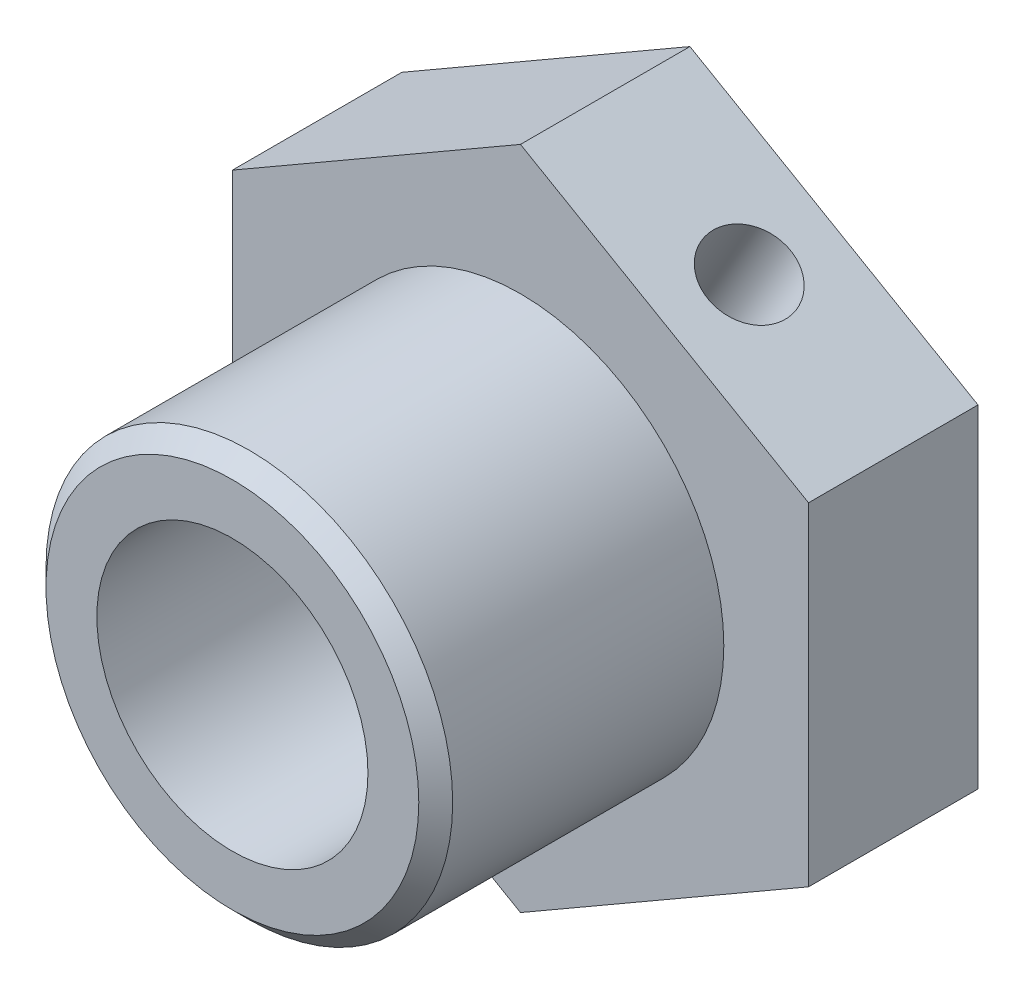
ISO-10303-21;
HEADER;
FILE_DESCRIPTION(('STEP AP214'),'2;1');
FILE_NAME('part.step','',(''),(''),'','','');
FILE_SCHEMA(('AUTOMOTIVE_DESIGN { 1 0 10303 214 1 1 1 1 }'));
ENDSEC;
DATA;
#1=APPLICATION_CONTEXT('core data for automotive mechanical design processes');
#2=APPLICATION_PROTOCOL_DEFINITION('international standard','automotive_design',2000,#1);
#3=PRODUCT_CONTEXT('',#1,'mechanical');
#4=PRODUCT('Part','Part','',(#3));
#5=PRODUCT_RELATED_PRODUCT_CATEGORY('part','',(#4));
#6=PRODUCT_DEFINITION_FORMATION('','',#4);
#7=PRODUCT_DEFINITION_CONTEXT('part definition',#1,'design');
#8=PRODUCT_DEFINITION('design','',#6,#7);
#9=PRODUCT_DEFINITION_SHAPE('','',#8);
#10=(LENGTH_UNIT() NAMED_UNIT(*) SI_UNIT(.MILLI.,.METRE.));
#11=(NAMED_UNIT(*) PLANE_ANGLE_UNIT() SI_UNIT($,.RADIAN.));
#12=(NAMED_UNIT(*) SI_UNIT($,.STERADIAN.) SOLID_ANGLE_UNIT());
#13=UNCERTAINTY_MEASURE_WITH_UNIT(LENGTH_MEASURE(1.E-05),#10,'distance_accuracy_value','');
#14=(GEOMETRIC_REPRESENTATION_CONTEXT(3) GLOBAL_UNCERTAINTY_ASSIGNED_CONTEXT((#13)) GLOBAL_UNIT_ASSIGNED_CONTEXT((#10,
#11,#12)) REPRESENTATION_CONTEXT('',''));
#15=CARTESIAN_POINT('',(0.,0.,0.));
#16=DIRECTION('',(0.,0.,1.));
#17=DIRECTION('',(1.,0.,0.));
#18=AXIS2_PLACEMENT_3D('',#15,#16,#17);
#19=CARTESIAN_POINT('',(8.49999999999993,4.90747728811191,5.));
#20=DIRECTION('',(-0.499999999999995,-0.866025403784441,0.));
#21=DIRECTION('',(0.866025403784441,-0.499999999999995,0.));
#22=AXIS2_PLACEMENT_3D('',#19,#20,#21);
#23=PLANE('',#22);
#24=CARTESIAN_POINT('',(4.24999999999997,7.36121593216777,2.5));
#25=DIRECTION('',(0.499999999999995,0.866025403784442,0.));
#26=DIRECTION('',(-0.866025403784442,0.499999999999995,0.));
#27=AXIS2_PLACEMENT_3D('',#24,#25,#26);
#28=CIRCLE('',#27,1.225);
#29=CARTESIAN_POINT('',(3.18911888036403,7.97371593216776,2.5));
#30=VERTEX_POINT('',#29);
#31=EDGE_CURVE('E187',#30,#30,#28,.T.);
#32=ORIENTED_EDGE('',*,*,#31,.F.);
#33=EDGE_LOOP('',(#32));
#34=FACE_BOUND('',#33,.T.);
#35=DIRECTION('',(-0.866025403784441,0.499999999999995,0.));
#36=VECTOR('',#35,1.);
#37=CARTESIAN_POINT('',(8.49999999999993,4.90747728811191,0.));
#38=LINE('',#37,#36);
#39=CARTESIAN_POINT('',(8.49999999999993,4.90747728811191,0.));
#40=VERTEX_POINT('',#39);
#41=CARTESIAN_POINT('',(0.,9.81495457622363,0.));
#42=VERTEX_POINT('',#41);
#43=EDGE_CURVE('E148',#40,#42,#38,.T.);
#44=ORIENTED_EDGE('',*,*,#43,.T.);
#45=DIRECTION('',(0.,0.,-1.));
#46=VECTOR('',#45,1.);
#47=CARTESIAN_POINT('',(0.,9.81495457622363,5.));
#48=LINE('',#47,#46);
#49=CARTESIAN_POINT('',(0.,9.81495457622363,5.));
#50=VERTEX_POINT('',#49);
#51=EDGE_CURVE('E174',#50,#42,#48,.T.);
#52=ORIENTED_EDGE('',*,*,#51,.F.);
#53=DIRECTION('',(-0.866025403784441,0.499999999999995,0.));
#54=VECTOR('',#53,1.);
#55=CARTESIAN_POINT('',(8.49999999999993,4.90747728811191,5.));
#56=LINE('',#55,#54);
#57=CARTESIAN_POINT('',(8.49999999999993,4.90747728811191,5.));
#58=VERTEX_POINT('',#57);
#59=EDGE_CURVE('E162',#58,#50,#56,.T.);
#60=ORIENTED_EDGE('',*,*,#59,.F.);
#61=DIRECTION('',(0.,0.,-1.));
#62=VECTOR('',#61,1.);
#63=CARTESIAN_POINT('',(8.49999999999993,4.90747728811191,5.));
#64=LINE('',#63,#62);
#65=EDGE_CURVE('E142',#58,#40,#64,.T.);
#66=ORIENTED_EDGE('',*,*,#65,.T.);
#67=EDGE_LOOP('',(#44,#52,#60,#66));
#68=FACE_BOUND('',#67,.T.);
#69=ADVANCED_FACE('F50',(#34,#68),#23,.F.);
#70=CARTESIAN_POINT('',(0.,9.81495457622363,5.));
#71=DIRECTION('',(0.500000000000001,-0.866025403784438,0.));
#72=DIRECTION('',(0.866025403784438,0.500000000000001,0.));
#73=AXIS2_PLACEMENT_3D('',#70,#71,#72);
#74=PLANE('',#73);
#75=DIRECTION('',(-0.866025403784438,-0.500000000000001,0.));
#76=VECTOR('',#75,1.);
#77=CARTESIAN_POINT('',(0.,9.81495457622363,0.));
#78=LINE('',#77,#76);
#79=CARTESIAN_POINT('',(-8.5,4.90747728811179,0.));
#80=VERTEX_POINT('',#79);
#81=EDGE_CURVE('E147',#42,#80,#78,.T.);
#82=ORIENTED_EDGE('',*,*,#81,.T.);
#83=DIRECTION('',(0.,0.,-1.));
#84=VECTOR('',#83,1.);
#85=CARTESIAN_POINT('',(-8.5,4.90747728811179,5.));
#86=LINE('',#85,#84);
#87=CARTESIAN_POINT('',(-8.5,4.90747728811179,5.));
#88=VERTEX_POINT('',#87);
#89=EDGE_CURVE('E168',#88,#80,#86,.T.);
#90=ORIENTED_EDGE('',*,*,#89,.F.);
#91=DIRECTION('',(-0.866025403784438,-0.500000000000001,0.));
#92=VECTOR('',#91,1.);
#93=CARTESIAN_POINT('',(0.,9.81495457622363,5.));
#94=LINE('',#93,#92);
#95=EDGE_CURVE('E112',#50,#88,#94,.T.);
#96=ORIENTED_EDGE('',*,*,#95,.F.);
#97=ORIENTED_EDGE('',*,*,#51,.T.);
#98=EDGE_LOOP('',(#82,#90,#96,#97));
#99=FACE_BOUND('',#98,.T.);
#100=ADVANCED_FACE('F201',(#99),#74,.F.);
#101=CARTESIAN_POINT('',(-8.5,4.90747728811179,5.));
#102=DIRECTION('',(1.,0.,0.));
#103=DIRECTION('',(0.,1.,0.));
#104=AXIS2_PLACEMENT_3D('',#101,#102,#103);
#105=PLANE('',#104);
#106=DIRECTION('',(0.,-1.,0.));
#107=VECTOR('',#106,1.);
#108=CARTESIAN_POINT('',(-8.5,4.90747728811179,0.));
#109=LINE('',#108,#107);
#110=CARTESIAN_POINT('',(-8.49999999999997,-4.90747728811185,0.));
#111=VERTEX_POINT('',#110);
#112=EDGE_CURVE('E152',#80,#111,#109,.T.);
#113=ORIENTED_EDGE('',*,*,#112,.T.);
#114=DIRECTION('',(0.,0.,-1.));
#115=VECTOR('',#114,1.);
#116=CARTESIAN_POINT('',(-8.49999999999997,-4.90747728811185,5.));
#117=LINE('',#116,#115);
#118=CARTESIAN_POINT('',(-8.49999999999997,-4.90747728811185,5.));
#119=VERTEX_POINT('',#118);
#120=EDGE_CURVE('E131',#119,#111,#117,.T.);
#121=ORIENTED_EDGE('',*,*,#120,.F.);
#122=DIRECTION('',(0.,-1.,0.));
#123=VECTOR('',#122,1.);
#124=CARTESIAN_POINT('',(-8.5,4.90747728811179,5.));
#125=LINE('',#124,#123);
#126=EDGE_CURVE('E122',#88,#119,#125,.T.);
#127=ORIENTED_EDGE('',*,*,#126,.F.);
#128=ORIENTED_EDGE('',*,*,#89,.T.);
#129=EDGE_LOOP('',(#113,#121,#127,#128));
#130=FACE_BOUND('',#129,.T.);
#131=ADVANCED_FACE('F209',(#130),#105,.F.);
#132=CARTESIAN_POINT('',(-8.49999999999997,-4.90747728811185,5.));
#133=DIRECTION('',(0.499999999999995,0.866025403784442,0.));
#134=DIRECTION('',(-0.866025403784442,0.499999999999995,0.));
#135=AXIS2_PLACEMENT_3D('',#132,#133,#134);
#136=PLANE('',#135);
#137=CARTESIAN_POINT('',(-4.24999999999995,-7.36121593216774,2.5));
#138=DIRECTION('',(0.499999999999995,0.866025403784442,0.));
#139=DIRECTION('',(-0.866025403784442,0.499999999999995,0.));
#140=AXIS2_PLACEMENT_3D('',#137,#138,#139);
#141=CIRCLE('',#140,1.225);
#142=CARTESIAN_POINT('',(-5.31088111963589,-6.74871593216774,2.5));
#143=VERTEX_POINT('',#142);
#144=EDGE_CURVE('E247',#143,#143,#141,.T.);
#145=ORIENTED_EDGE('',*,*,#144,.T.);
#146=EDGE_LOOP('',(#145));
#147=FACE_BOUND('',#146,.T.);
#148=DIRECTION('',(0.866025403784441,-0.499999999999995,0.));
#149=VECTOR('',#148,1.);
#150=CARTESIAN_POINT('',(-8.49999999999997,-4.90747728811185,0.));
#151=LINE('',#150,#149);
#152=CARTESIAN_POINT('',(0.,-9.81495457622363,0.));
#153=VERTEX_POINT('',#152);
#154=EDGE_CURVE('E133',#111,#153,#151,.T.);
#155=ORIENTED_EDGE('',*,*,#154,.T.);
#156=DIRECTION('',(0.,0.,-1.));
#157=VECTOR('',#156,1.);
#158=CARTESIAN_POINT('',(0.,-9.81495457622363,5.));
#159=LINE('',#158,#157);
#160=CARTESIAN_POINT('',(0.,-9.81495457622363,5.));
#161=VERTEX_POINT('',#160);
#162=EDGE_CURVE('E128',#161,#153,#159,.T.);
#163=ORIENTED_EDGE('',*,*,#162,.F.);
#164=DIRECTION('',(0.866025403784441,-0.499999999999995,0.));
#165=VECTOR('',#164,1.);
#166=CARTESIAN_POINT('',(-8.49999999999997,-4.90747728811185,5.));
#167=LINE('',#166,#165);
#168=EDGE_CURVE('E118',#119,#161,#167,.T.);
#169=ORIENTED_EDGE('',*,*,#168,.F.);
#170=ORIENTED_EDGE('',*,*,#120,.T.);
#171=EDGE_LOOP('',(#155,#163,#169,#170));
#172=FACE_BOUND('',#171,.T.);
#173=ADVANCED_FACE('F132',(#147,#172),#136,.F.);
#174=CARTESIAN_POINT('',(0.,-9.81495457622363,5.));
#175=DIRECTION('',(-0.500000000000007,0.866025403784434,0.));
#176=DIRECTION('',(-0.866025403784435,-0.500000000000007,0.));
#177=AXIS2_PLACEMENT_3D('',#174,#175,#176);
#178=PLANE('',#177);
#179=DIRECTION('',(0.866025403784435,0.500000000000007,0.));
#180=VECTOR('',#179,1.);
#181=CARTESIAN_POINT('',(0.,-9.81495457622363,0.));
#182=LINE('',#181,#180);
#183=CARTESIAN_POINT('',(8.50000000000003,-4.90747728811173,0.));
#184=VERTEX_POINT('',#183);
#185=EDGE_CURVE('E96',#153,#184,#182,.T.);
#186=ORIENTED_EDGE('',*,*,#185,.T.);
#187=DIRECTION('',(0.,0.,-1.));
#188=VECTOR('',#187,1.);
#189=CARTESIAN_POINT('',(8.50000000000003,-4.90747728811173,5.));
#190=LINE('',#189,#188);
#191=CARTESIAN_POINT('',(8.50000000000003,-4.90747728811173,5.));
#192=VERTEX_POINT('',#191);
#193=EDGE_CURVE('E138',#192,#184,#190,.T.);
#194=ORIENTED_EDGE('',*,*,#193,.F.);
#195=DIRECTION('',(0.866025403784435,0.500000000000007,0.));
#196=VECTOR('',#195,1.);
#197=CARTESIAN_POINT('',(0.,-9.81495457622363,5.));
#198=LINE('',#197,#196);
#199=EDGE_CURVE('E125',#161,#192,#198,.T.);
#200=ORIENTED_EDGE('',*,*,#199,.F.);
#201=ORIENTED_EDGE('',*,*,#162,.T.);
#202=EDGE_LOOP('',(#186,#194,#200,#201));
#203=FACE_BOUND('',#202,.T.);
#204=ADVANCED_FACE('F136',(#203),#178,.F.);
#205=CARTESIAN_POINT('',(8.50000000000003,-4.90747728811173,5.));
#206=DIRECTION('',(-1.,0.,0.));
#207=DIRECTION('',(0.,-1.,0.));
#208=AXIS2_PLACEMENT_3D('',#205,#206,#207);
#209=PLANE('',#208);
#210=DIRECTION('',(0.,1.,0.));
#211=VECTOR('',#210,1.);
#212=CARTESIAN_POINT('',(8.50000000000003,-4.90747728811173,0.));
#213=LINE('',#212,#211);
#214=EDGE_CURVE('E105',#184,#40,#213,.T.);
#215=ORIENTED_EDGE('',*,*,#214,.T.);
#216=ORIENTED_EDGE('',*,*,#65,.F.);
#217=DIRECTION('',(0.,1.,0.));
#218=VECTOR('',#217,1.);
#219=CARTESIAN_POINT('',(8.50000000000003,-4.90747728811173,5.));
#220=LINE('',#219,#218);
#221=EDGE_CURVE('E71',#192,#58,#220,.T.);
#222=ORIENTED_EDGE('',*,*,#221,.F.);
#223=ORIENTED_EDGE('',*,*,#193,.T.);
#224=EDGE_LOOP('',(#215,#216,#222,#223));
#225=FACE_BOUND('',#224,.T.);
#226=ADVANCED_FACE('F225',(#225),#209,.F.);
#227=CARTESIAN_POINT('',(0.,0.,5.));
#228=DIRECTION('',(0.,0.,1.));
#229=DIRECTION('',(1.,0.,0.));
#230=AXIS2_PLACEMENT_3D('',#227,#228,#229);
#231=PLANE('',#230);
#232=CARTESIAN_POINT('',(0.,0.,5.));
#233=DIRECTION('',(0.,0.,1.));
#234=DIRECTION('',(1.,0.,0.));
#235=AXIS2_PLACEMENT_3D('',#232,#233,#234);
#236=CIRCLE('',#235,6.);
#237=CARTESIAN_POINT('',(6.,0.,5.));
#238=VERTEX_POINT('',#237);
#239=EDGE_CURVE('E180',#238,#238,#236,.T.);
#240=ORIENTED_EDGE('',*,*,#239,.F.);
#241=EDGE_LOOP('',(#240));
#242=FACE_BOUND('',#241,.T.);
#243=ORIENTED_EDGE('',*,*,#59,.T.);
#244=ORIENTED_EDGE('',*,*,#95,.T.);
#245=ORIENTED_EDGE('',*,*,#126,.T.);
#246=ORIENTED_EDGE('',*,*,#168,.T.);
#247=ORIENTED_EDGE('',*,*,#199,.T.);
#248=ORIENTED_EDGE('',*,*,#221,.T.);
#249=EDGE_LOOP('',(#243,#244,#245,#246,#247,#248));
#250=FACE_BOUND('',#249,.T.);
#251=ADVANCED_FACE('F116',(#242,#250),#231,.T.);
#252=CARTESIAN_POINT('',(0.,0.,0.));
#253=DIRECTION('',(0.,0.,1.));
#254=DIRECTION('',(1.,0.,0.));
#255=AXIS2_PLACEMENT_3D('',#252,#253,#254);
#256=PLANE('',#255);
#257=CARTESIAN_POINT('',(0.,0.,0.));
#258=DIRECTION('',(0.,0.,1.));
#259=DIRECTION('',(1.,0.,0.));
#260=AXIS2_PLACEMENT_3D('',#257,#258,#259);
#261=CIRCLE('',#260,4.);
#262=CARTESIAN_POINT('',(4.,0.,0.));
#263=VERTEX_POINT('',#262);
#264=EDGE_CURVE('E151',#263,#263,#261,.T.);
#265=ORIENTED_EDGE('',*,*,#264,.T.);
#266=EDGE_LOOP('',(#265));
#267=FACE_BOUND('',#266,.T.);
#268=ORIENTED_EDGE('',*,*,#43,.F.);
#269=ORIENTED_EDGE('',*,*,#214,.F.);
#270=ORIENTED_EDGE('',*,*,#185,.F.);
#271=ORIENTED_EDGE('',*,*,#154,.F.);
#272=ORIENTED_EDGE('',*,*,#112,.F.);
#273=ORIENTED_EDGE('',*,*,#81,.F.);
#274=EDGE_LOOP('',(#268,#269,#270,#271,#272,#273));
#275=FACE_BOUND('',#274,.T.);
#276=ADVANCED_FACE('F223',(#267,#275),#256,.F.);
#277=CARTESIAN_POINT('',(0.,0.,13.5));
#278=DIRECTION('',(0.,0.,-1.));
#279=DIRECTION('',(-1.,0.,0.));
#280=AXIS2_PLACEMENT_3D('',#277,#278,#279);
#281=CYLINDRICAL_SURFACE('',#280,6.);
#282=CARTESIAN_POINT('',(0.,0.,13.));
#283=DIRECTION('',(0.,0.,1.));
#284=DIRECTION('',(1.,0.,0.));
#285=AXIS2_PLACEMENT_3D('',#282,#283,#284);
#286=CIRCLE('',#285,6.);
#287=CARTESIAN_POINT('',(6.,0.,13.));
#288=VERTEX_POINT('',#287);
#289=EDGE_CURVE('E11',#288,#288,#286,.F.);
#290=ORIENTED_EDGE('',*,*,#289,.T.);
#291=EDGE_LOOP('',(#290));
#292=FACE_BOUND('',#291,.T.);
#293=ORIENTED_EDGE('',*,*,#239,.T.);
#294=EDGE_LOOP('',(#293));
#295=FACE_BOUND('',#294,.T.);
#296=ADVANCED_FACE('F228',(#292,#295),#281,.T.);
#297=CARTESIAN_POINT('',(0.,0.,13.5));
#298=DIRECTION('',(0.,0.,1.));
#299=DIRECTION('',(1.,0.,0.));
#300=AXIS2_PLACEMENT_3D('',#297,#298,#299);
#301=PLANE('',#300);
#302=CARTESIAN_POINT('',(0.,0.,13.5));
#303=DIRECTION('',(0.,0.,1.));
#304=DIRECTION('',(1.,0.,0.));
#305=AXIS2_PLACEMENT_3D('',#302,#303,#304);
#306=CIRCLE('',#305,5.50000000000001);
#307=CARTESIAN_POINT('',(5.50000000000001,0.,13.5));
#308=VERTEX_POINT('',#307);
#309=EDGE_CURVE('E64',#308,#308,#306,.T.);
#310=ORIENTED_EDGE('',*,*,#309,.T.);
#311=EDGE_LOOP('',(#310));
#312=FACE_BOUND('',#311,.T.);
#313=CARTESIAN_POINT('',(0.,0.,13.5));
#314=DIRECTION('',(0.,0.,1.));
#315=DIRECTION('',(1.,0.,0.));
#316=AXIS2_PLACEMENT_3D('',#313,#314,#315);
#317=CIRCLE('',#316,4.);
#318=CARTESIAN_POINT('',(4.,0.,13.5));
#319=VERTEX_POINT('',#318);
#320=EDGE_CURVE('E248',#319,#319,#317,.T.);
#321=ORIENTED_EDGE('',*,*,#320,.F.);
#322=EDGE_LOOP('',(#321));
#323=FACE_BOUND('',#322,.T.);
#324=ADVANCED_FACE('F232',(#312,#323),#301,.T.);
#325=CARTESIAN_POINT('',(0.,0.,0.));
#326=DIRECTION('',(0.,0.,1.));
#327=DIRECTION('',(1.,0.,0.));
#328=AXIS2_PLACEMENT_3D('',#325,#326,#327);
#329=CYLINDRICAL_SURFACE('',#328,4.);
#330=CARTESIAN_POINT('',(-2.96478336239945,-2.68515541711079,2.5));
#331=CARTESIAN_POINT('',(-2.96478307936612,-2.68515622921998,2.43294638749556));
#332=CARTESIAN_POINT('',(-2.96089450387517,-2.68946820362656,2.36588631647753));
#333=CARTESIAN_POINT('',(-2.94540682121258,-2.70641955049063,2.2337314785813));
#334=CARTESIAN_POINT('',(-2.93380538402273,-2.71906143936473,2.16863731180748));
#335=CARTESIAN_POINT('',(-2.90310348151862,-2.75181553896026,2.04234708406576));
#336=CARTESIAN_POINT('',(-2.88401588083734,-2.77191493111863,1.98114454408508));
#337=CARTESIAN_POINT('',(-2.83859923892701,-2.81840493366182,1.86405139719646));
#338=CARTESIAN_POINT('',(-2.8122690157677,-2.84479657079016,1.80816165929442));
#339=CARTESIAN_POINT('',(-2.75178426845012,-2.90336072783387,1.70143707937569));
#340=CARTESIAN_POINT('',(-2.71741935354504,-2.93568249074879,1.65080332273628));
#341=CARTESIAN_POINT('',(-2.64175893477227,-3.00394780694326,1.55782168724445));
#342=CARTESIAN_POINT('',(-2.60046250388225,-3.03989184440926,1.51547491833837));
#343=CARTESIAN_POINT('',(-2.51056164657266,-3.11457267002135,1.43938913338761));
#344=CARTESIAN_POINT('',(-2.46181844235544,-3.15335305467796,1.40585616570239));
#345=CARTESIAN_POINT('',(-2.35864264196173,-3.2312499039202,1.34970457688957));
#346=CARTESIAN_POINT('',(-2.30421133060854,-3.27036629078578,1.32708349745215));
#347=CARTESIAN_POINT('',(-2.19266126315406,-3.34613891057488,1.2940662183573));
#348=CARTESIAN_POINT('',(-2.13567051979231,-3.38283371006611,1.28332655865007));
#349=CARTESIAN_POINT('',(-2.01914607291516,-3.45364923679525,1.27328986340545));
#350=CARTESIAN_POINT('',(-1.95961292810137,-3.48777052505867,1.27399032663545));
#351=CARTESIAN_POINT('',(-1.84182696679116,-3.55133875784373,1.28658573050201));
#352=CARTESIAN_POINT('',(-1.78359719208813,-3.58090321657117,1.29810854171067));
#353=CARTESIAN_POINT('',(-1.66821877532558,-3.63608829845143,1.33141232815392));
#354=CARTESIAN_POINT('',(-1.61107020303545,-3.66170866785059,1.35319396305204));
#355=CARTESIAN_POINT('',(-1.49891248273907,-3.70904490979012,1.40664266644119));
#356=CARTESIAN_POINT('',(-1.44393705229281,-3.73071047720681,1.43842472995853));
#357=CARTESIAN_POINT('',(-1.33852694359828,-3.76981577862057,1.5108805198579));
#358=CARTESIAN_POINT('',(-1.2880933825501,-3.78725447467474,1.55155642554107));
#359=CARTESIAN_POINT('',(-1.19143296986043,-3.81879267812704,1.64256565861759));
#360=CARTESIAN_POINT('',(-1.14545590373678,-3.83273024315136,1.69322084042848));
#361=CARTESIAN_POINT('',(-1.06175605815753,-3.85675708414429,1.80176246813763));
#362=CARTESIAN_POINT('',(-1.02403417253905,-3.86684594347864,1.85964969602728));
#363=CARTESIAN_POINT('',(-0.95802343767554,-3.88373131632066,1.98182323100452));
#364=CARTESIAN_POINT('',(-0.9298363875687,-3.89049262999482,2.04616963186121));
#365=CARTESIAN_POINT('',(-0.884786079092578,-3.90098638985161,2.17894117790636));
#366=CARTESIAN_POINT('',(-0.867918942411668,-3.90471987348951,2.24736491740249));
#367=CARTESIAN_POINT('',(-0.846811586449323,-3.90935072590157,2.3835100302747));
#368=CARTESIAN_POINT('',(-0.842107793949411,-3.91035229970008,2.45115603735296));
#369=CARTESIAN_POINT('',(-0.844227731688357,-3.90989529835049,2.58625232675472));
#370=CARTESIAN_POINT('',(-0.851049766219995,-3.90843708509219,2.65370263640726));
#371=CARTESIAN_POINT('',(-0.875517073606093,-3.90302675537658,2.78457100323539));
#372=CARTESIAN_POINT('',(-0.892860461668632,-3.89914411406789,2.84804891130309));
#373=CARTESIAN_POINT('',(-0.937307593949305,-3.88869800634726,2.97125223815929));
#374=CARTESIAN_POINT('',(-0.964412887780412,-3.88213411428914,3.03097705941083));
#375=CARTESIAN_POINT('',(-1.02815332607142,-3.86574820716123,3.14681291980435));
#376=CARTESIAN_POINT('',(-1.06503212614156,-3.85584080673207,3.20277761986992));
#377=CARTESIAN_POINT('',(-1.1465479848371,-3.83239133150476,3.3078874671404));
#378=CARTESIAN_POINT('',(-1.1911869789112,-3.81884834950653,3.35703090756155));
#379=CARTESIAN_POINT('',(-1.28861584535169,-3.78710862546562,3.44910779451222));
#380=CARTESIAN_POINT('',(-1.34165832925489,-3.76874895788114,3.49171861525122));
#381=CARTESIAN_POINT('',(-1.4526931865672,-3.72735667151648,3.56709682203));
#382=CARTESIAN_POINT('',(-1.51068532255123,-3.70432427680495,3.59986467987697));
#383=CARTESIAN_POINT('',(-1.62922264149563,-3.6537310559705,3.65431101289666));
#384=CARTESIAN_POINT('',(-1.68974527684455,-3.62620568463264,3.67607124124728));
#385=CARTESIAN_POINT('',(-1.81170417659817,-3.56683621221558,3.70808575280582));
#386=CARTESIAN_POINT('',(-1.87314016193572,-3.53499340709402,3.71834348016943));
#387=CARTESIAN_POINT('',(-1.99244120553251,-3.46909741223771,3.72679099045622));
#388=CARTESIAN_POINT('',(-2.05035072754443,-3.43518385397012,3.72544771110857));
#389=CARTESIAN_POINT('',(-2.16345303179294,-3.36509980760978,3.71185399132951));
#390=CARTESIAN_POINT('',(-2.21864597913977,-3.328929456986,3.69960421464825));
#391=CARTESIAN_POINT('',(-2.32427901184725,-3.2560407767348,3.66483843369696));
#392=CARTESIAN_POINT('',(-2.37476680064821,-3.21933366954952,3.64244315689484));
#393=CARTESIAN_POINT('',(-2.47066470387881,-3.14633939282303,3.58813056776515));
#394=CARTESIAN_POINT('',(-2.51607396315935,-3.11005229492461,3.5562116551074));
#395=CARTESIAN_POINT('',(-2.60246405409083,-3.038164687814,3.48253934717658));
#396=CARTESIAN_POINT('',(-2.64324955150603,-3.00262624705711,3.44049643869233));
#397=CARTESIAN_POINT('',(-2.71803513771764,-2.93510282087047,3.3482856010924));
#398=CARTESIAN_POINT('',(-2.75203322830824,-2.90311888310782,3.2981152871279));
#399=CARTESIAN_POINT('',(-2.81377939910572,-2.84333496304669,3.18918188609482));
#400=CARTESIAN_POINT('',(-2.84129736579685,-2.8156981447372,3.13019822974913));
#401=CARTESIAN_POINT('',(-2.88828999035388,-2.76747557038089,3.00643927470717));
#402=CARTESIAN_POINT('',(-2.90776821427056,-2.74688668889469,2.94166655930751));
#403=CARTESIAN_POINT('',(-2.93691675869587,-2.71568249665933,2.81461574088468));
#404=CARTESIAN_POINT('',(-2.94735319455961,-2.70429543477795,2.75270180883585));
#405=CARTESIAN_POINT('',(-2.96128585915622,-2.68903234479872,2.62719360344746));
#406=CARTESIAN_POINT('',(-2.96478363085385,-2.68515464683302,2.56359970687298));
#407=CARTESIAN_POINT('',(-2.96478336239945,-2.68515541711079,2.5));
#408=B_SPLINE_CURVE_WITH_KNOTS('',3,(#330,#331,#332,#333,#334,#335,#336,#337,#338,#339,#340,
#341,#342,#343,#344,#345,#346,#347,#348,#349,#350,#351,#352,#353,#354,#355,#356,#357,#358,#359,
#360,#361,#362,#363,#364,#365,#366,#367,#368,#369,#370,#371,#372,#373,#374,#375,#376,#377,#378,
#379,#380,#381,#382,#383,#384,#385,#386,#387,#388,#389,#390,#391,#392,#393,#394,#395,#396,#397,
#398,#399,#400,#401,#402,#403,#404,#405,#406,#407),.UNSPECIFIED.,.T.,.F.,(4,2,2,2,2,2,2,2,2,2,2,
2,2,2,2,2,2,2,2,2,2,2,2,2,2,2,2,2,2,2,2,2,2,2,2,2,2,2,4),(0.,0.200926067715669,
0.401912861822971,0.602555771993445,0.803231444711077,1.00990679441027,1.2166098069686,
1.42778480431008,1.63891220436201,1.84376262122337,2.04856825083152,2.24657978666472,
2.44460405678695,2.64499417914314,2.84543345919698,3.05391032523437,3.26240975313593,
3.47306972920447,3.68365749423597,3.88609228995755,4.08849730558155,4.28535269369484,
4.48223934457825,4.68459144065633,4.88699407741047,5.09740474983746,5.30780533494477,
5.51661945719038,5.72537103820695,5.92576081954075,6.12613840634013,6.32419178600239,
6.5222784648663,6.72689521188734,6.93157210933058,7.14268421861337,7.35370258763155,
7.54432142440346,7.73489786812616),.UNSPECIFIED.);
#409=CARTESIAN_POINT('',(-2.96478336239945,-2.68515541711079,2.5));
#410=VERTEX_POINT('',#409);
#411=EDGE_CURVE('E55',#410,#410,#408,.T.);
#412=ORIENTED_EDGE('',*,*,#411,.T.);
#413=EDGE_LOOP('',(#412));
#414=FACE_BOUND('',#413,.T.);
#415=CARTESIAN_POINT('',(0.843021123127571,3.91015541711077,2.5));
#416=CARTESIAN_POINT('',(0.843021967951432,3.91015557805131,2.56705361250444));
#417=CARTESIAN_POINT('',(0.848700535073471,3.90894396009491,2.63411368352247));
#418=CARTESIAN_POINT('',(0.871124673417407,3.90400690689539,2.7662685214187));
#419=CARTESIAN_POINT('',(0.887873588929128,3.90028071200562,2.83136268819252));
#420=CARTESIAN_POINT('',(0.931590422508998,3.89006913429031,2.95765291593424));
#421=CARTESIAN_POINT('',(0.958540807059411,3.88358848328222,3.01885545591492));
#422=CARTESIAN_POINT('',(1.02151065123899,3.86750151890489,3.13594860280354));
#423=CARTESIAN_POINT('',(1.05753159101924,3.85789469532578,3.19183834070558));
#424=CARTESIAN_POINT('',(1.1384920124291,3.83479544612913,3.29856292062431));
#425=CARTESIAN_POINT('',(1.18366593766106,3.8211954382799,3.34919667726372));
#426=CARTESIAN_POINT('',(1.28061564506924,3.78980425165895,3.44217831275555));
#427=CARTESIAN_POINT('',(1.33239231007439,3.77201251215556,3.48452508166163));
#428=CARTESIAN_POINT('',(1.44201823088484,3.73149649870951,3.56061086661239));
#429=CARTESIAN_POINT('',(1.49997463127461,3.70867383792384,3.59414383429761));
#430=CARTESIAN_POINT('',(1.61902318179001,3.65826939834822,3.65029542311043));
#431=CARTESIAN_POINT('',(1.68011462219646,3.63068869338785,3.67291650254785));
#432=CARTESIAN_POINT('',(1.80151066957236,3.57196981107296,3.7059337816427));
#433=CARTESIAN_POINT('',(1.86178466979942,3.54096177928673,3.71667344134993));
#434=CARTESIAN_POINT('',(1.9813749383678,3.47545641149377,3.72671013659455));
#435=CARTESIAN_POINT('',(2.04069141322067,3.44095983984955,3.72600967336455));
#436=CARTESIAN_POINT('',(2.15463609834132,3.37073832153828,3.71341426949799));
#437=CARTESIAN_POINT('',(2.20935455799993,3.33509208675253,3.70189145828933));
#438=CARTESIAN_POINT('',(2.31483544919944,3.26276398772786,3.66858767184608));
#439=CARTESIAN_POINT('',(2.36559762609853,3.22608205703417,3.64680603694796));
#440=CARTESIAN_POINT('',(2.46267087428603,3.15261874299672,3.59335733355881));
#441=CARTESIAN_POINT('',(2.50892152127942,3.11584140735463,3.56157527004147));
#442=CARTESIAN_POINT('',(2.59549276007366,3.04410622611637,3.4891194801421));
#443=CARTESIAN_POINT('',(2.63581189438953,3.00914882907242,3.44844357445893));
#444=CARTESIAN_POINT('',(2.71145498611378,2.94120755786903,3.35743434138241));
#445=CARTESIAN_POINT('',(2.74651380455356,2.90835903312662,3.30677915957152));
#446=CARTESIAN_POINT('',(2.80917158201575,2.84788626105863,3.19823753186237));
#447=CARTESIAN_POINT('',(2.83676973330375,2.82026257950155,3.14035030397272));
#448=CARTESIAN_POINT('',(2.88439826256906,2.77153829260828,3.01817676899548));
#449=CARTESIAN_POINT('',(2.90434725702726,2.75050824799509,2.9538303681388));
#450=CARTESIAN_POINT('',(2.93596027388252,2.71674041633484,2.82105882209364));
#451=CARTESIAN_POINT('',(2.94762713389801,2.70399978929901,2.75263508259751));
#452=CARTESIAN_POINT('',(2.9621912477092,2.68803570903493,2.6164899697253));
#453=CARTESIAN_POINT('',(2.96541053231243,2.68446289213513,2.54884396264704));
#454=CARTESIAN_POINT('',(2.96395478866465,2.68607031139671,2.41374767324529));
#455=CARTESIAN_POINT('',(2.95928092167301,2.69124925997745,2.34629736359274));
#456=CARTESIAN_POINT('',(2.94236178500339,2.70973340487821,2.21542899676461));
#457=CARTESIAN_POINT('',(2.93032762496502,2.72281189887372,2.15195108869691));
#458=CARTESIAN_POINT('',(2.89905746416794,2.75608119069383,2.02874776184071));
#459=CARTESIAN_POINT('',(2.87982031998236,2.77627311769955,1.96902294058918));
#460=CARTESIAN_POINT('',(2.83375948900003,2.82328100294396,1.85318708019565));
#461=CARTESIAN_POINT('',(2.80674002850785,2.85026528045121,1.79722238013008));
#462=CARTESIAN_POINT('',(2.7456742579078,2.90913534727919,1.6921125328596));
#463=CARTESIAN_POINT('',(2.7116261944173,2.94102235914763,1.64296909243845));
#464=CARTESIAN_POINT('',(2.63542435386852,3.00952837052657,1.55089220548778));
#465=CARTESIAN_POINT('',(2.59300317338371,3.04628467527432,1.50828138474878));
#466=CARTESIAN_POINT('',(2.50163897321505,3.12174753923003,1.43290317797));
#467=CARTESIAN_POINT('',(2.45269626629285,3.16045400485615,1.40013532012304));
#468=CARTESIAN_POINT('',(2.34961259231874,3.23781372394128,1.34568898710334));
#469=CARTESIAN_POINT('',(2.2955136038171,3.27646517798849,1.32392875875272));
#470=CARTESIAN_POINT('',(2.18311868261783,3.3523999471842,1.29191424719418));
#471=CARTESIAN_POINT('',(2.12482401178603,3.38968366863226,1.28165651983057));
#472=CARTESIAN_POINT('',(2.00810588443442,3.46005340565692,1.27320900954378));
#473=CARTESIAN_POINT('',(1.949781120436,3.49324774370646,1.27455228889143));
#474=CARTESIAN_POINT('',(1.83253540376369,3.55615518923206,1.28814600867049));
#475=CARTESIAN_POINT('',(1.77361448758629,3.58586850843226,1.30039578535175));
#476=CARTESIAN_POINT('',(1.65767452248669,3.64090505811013,1.33516156630304));
#477=CARTESIAN_POINT('',(1.60064134076432,3.66627521220003,1.35755684310516));
#478=CARTESIAN_POINT('',(1.489477491173,3.71282809420413,1.41186943223485));
#479=CARTESIAN_POINT('',(1.43534731292309,3.7340101173589,1.4437883448926));
#480=CARTESIAN_POINT('',(1.32989577348229,3.77288232718551,1.51746065282342));
#481=CARTESIAN_POINT('',(1.27872583226833,3.79043438367462,1.55950356130767));
#482=CARTESIAN_POINT('',(1.18285603673433,3.82143888807746,1.6517143989076));
#483=CARTESIAN_POINT('',(1.13815808882352,3.83489012932776,1.7018847128721));
#484=CARTESIAN_POINT('',(1.05551060991402,3.85847192179422,1.81081811390518));
#485=CARTESIAN_POINT('',(1.01781743983266,3.86848477085449,1.86980177025087));
#486=CARTESIAN_POINT('',(0.952559153125697,3.88507029033322,1.99356072529283));
#487=CARTESIAN_POINT('',(0.924989546764799,3.89164448632258,2.05833344069249));
#488=CARTESIAN_POINT('',(0.883391651371744,3.90128577016055,2.18538425911532));
#489=CARTESIAN_POINT('',(0.868311948576137,3.90463045780283,2.24729819116415));
#490=CARTESIAN_POINT('',(0.848127392615572,3.90906495429629,2.37280639655254));
#491=CARTESIAN_POINT('',(0.84302032182026,3.91015526446022,2.43640029312702));
#492=CARTESIAN_POINT('',(0.843021123127571,3.91015541711077,2.5));
#493=B_SPLINE_CURVE_WITH_KNOTS('',3,(#415,#416,#417,#418,#419,#420,#421,#422,#423,#424,#425,
#426,#427,#428,#429,#430,#431,#432,#433,#434,#435,#436,#437,#438,#439,#440,#441,#442,#443,#444,
#445,#446,#447,#448,#449,#450,#451,#452,#453,#454,#455,#456,#457,#458,#459,#460,#461,#462,#463,
#464,#465,#466,#467,#468,#469,#470,#471,#472,#473,#474,#475,#476,#477,#478,#479,#480,#481,#482,
#483,#484,#485,#486,#487,#488,#489,#490,#491,#492),.UNSPECIFIED.,.T.,.F.,(4,2,2,2,2,2,2,2,2,2,2,
2,2,2,2,2,2,2,2,2,2,2,2,2,2,2,2,2,2,2,2,2,2,2,2,2,2,2,4),(0.,0.200926067715669,0.40191286182297,
0.602555771993445,0.803231444711077,1.00990679441027,1.2166098069686,1.42778480431008,
1.63891220436201,1.84376262122337,2.04856825083151,2.24657978666472,2.44460405678695,
2.64499417914313,2.84543345919698,3.05391032523437,3.26240975313593,3.47306972920447,
3.68365749423597,3.88609228995755,4.08849730558155,4.28535269369483,4.48223934457824,
4.68459144065632,4.88699407741047,5.09740474983746,5.30780533494476,5.51661945719038,
5.72537103820695,5.92576081954075,6.12613840634013,6.32419178600239,6.52227846486629,
6.72689521188733,6.93157210933058,7.14268421861337,7.35370258763155,7.54432142440346,
7.73489786812616),.UNSPECIFIED.);
#494=CARTESIAN_POINT('',(0.843021123127571,3.91015541711077,2.5));
#495=VERTEX_POINT('',#494);
#496=EDGE_CURVE('E179',#495,#495,#493,.T.);
#497=ORIENTED_EDGE('',*,*,#496,.T.);
#498=EDGE_LOOP('',(#497));
#499=FACE_BOUND('',#498,.T.);
#500=ORIENTED_EDGE('',*,*,#264,.F.);
#501=EDGE_LOOP('',(#500));
#502=FACE_BOUND('',#501,.T.);
#503=ORIENTED_EDGE('',*,*,#320,.T.);
#504=EDGE_LOOP('',(#503));
#505=FACE_BOUND('',#504,.T.);
#506=ADVANCED_FACE('F190',(#414,#499,#502,#505),#329,.F.);
#507=CARTESIAN_POINT('',(0.,0.,13.5));
#508=DIRECTION('',(0.,0.,-1.));
#509=DIRECTION('',(-1.,0.,0.));
#510=AXIS2_PLACEMENT_3D('',#507,#508,#509);
#511=CONICAL_SURFACE('',#510,5.50000000000001,0.785398163397444);
#512=ORIENTED_EDGE('',*,*,#289,.F.);
#513=EDGE_LOOP('',(#512));
#514=FACE_BOUND('',#513,.T.);
#515=ORIENTED_EDGE('',*,*,#309,.F.);
#516=EDGE_LOOP('',(#515));
#517=FACE_BOUND('',#516,.T.);
#518=ADVANCED_FACE('F49',(#514,#517),#511,.T.);
#519=CARTESIAN_POINT('',(-6.37499999999993,-11.0418238982516,2.5));
#520=DIRECTION('',(0.499999999999995,0.866025403784441,0.));
#521=DIRECTION('',(-0.866025403784441,0.499999999999995,0.));
#522=AXIS2_PLACEMENT_3D('',#519,#520,#521);
#523=CYLINDRICAL_SURFACE('',#522,1.225);
#524=ORIENTED_EDGE('',*,*,#31,.T.);
#525=EDGE_LOOP('',(#524));
#526=FACE_BOUND('',#525,.T.);
#527=ORIENTED_EDGE('',*,*,#496,.F.);
#528=EDGE_LOOP('',(#527));
#529=FACE_BOUND('',#528,.T.);
#530=ADVANCED_FACE('F191',(#526,#529),#523,.F.);
#531=ORIENTED_EDGE('',*,*,#411,.F.);
#532=EDGE_LOOP('',(#531));
#533=FACE_BOUND('',#532,.T.);
#534=ORIENTED_EDGE('',*,*,#144,.F.);
#535=EDGE_LOOP('',(#534));
#536=FACE_BOUND('',#535,.T.);
#537=ADVANCED_FACE('F186',(#533,#536),#523,.F.);
#538=CLOSED_SHELL('',(#69,#100,#131,#173,#204,#226,#251,#276,#296,#324,#506,#518,#530,#537));
#539=MANIFOLD_SOLID_BREP('B2',#538);
#540=ADVANCED_BREP_SHAPE_REPRESENTATION('',(#18,#539),#14);
#541=SHAPE_DEFINITION_REPRESENTATION(#9,#540);
ENDSEC;
END-ISO-10303-21;
